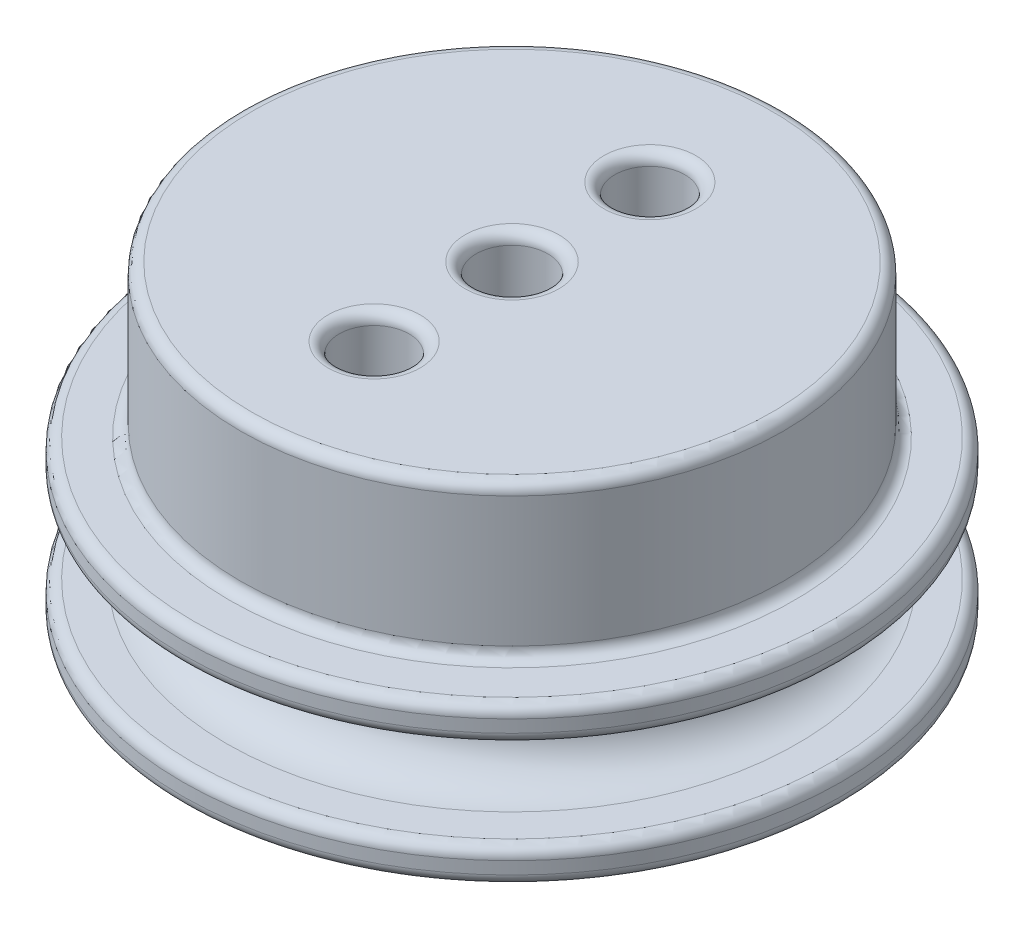
ISO-10303-21;
HEADER;
FILE_DESCRIPTION(('STEP AP214'),'2;1');
FILE_NAME('part.step','',(''),(''),'','','');
FILE_SCHEMA(('AUTOMOTIVE_DESIGN { 1 0 10303 214 1 1 1 1 }'));
ENDSEC;
DATA;
#1=APPLICATION_CONTEXT('core data for automotive mechanical design processes');
#2=APPLICATION_PROTOCOL_DEFINITION('international standard','automotive_design',2000,#1);
#3=PRODUCT_CONTEXT('',#1,'mechanical');
#4=PRODUCT('Part','Part','',(#3));
#5=PRODUCT_RELATED_PRODUCT_CATEGORY('part','',(#4));
#6=PRODUCT_DEFINITION_FORMATION('','',#4);
#7=PRODUCT_DEFINITION_CONTEXT('part definition',#1,'design');
#8=PRODUCT_DEFINITION('design','',#6,#7);
#9=PRODUCT_DEFINITION_SHAPE('','',#8);
#10=(LENGTH_UNIT() NAMED_UNIT(*) SI_UNIT(.MILLI.,.METRE.));
#11=(NAMED_UNIT(*) PLANE_ANGLE_UNIT() SI_UNIT($,.RADIAN.));
#12=(NAMED_UNIT(*) SI_UNIT($,.STERADIAN.) SOLID_ANGLE_UNIT());
#13=UNCERTAINTY_MEASURE_WITH_UNIT(LENGTH_MEASURE(1.E-05),#10,'distance_accuracy_value','');
#14=(GEOMETRIC_REPRESENTATION_CONTEXT(3) GLOBAL_UNCERTAINTY_ASSIGNED_CONTEXT((#13)) GLOBAL_UNIT_ASSIGNED_CONTEXT((#10,
#11,#12)) REPRESENTATION_CONTEXT('',''));
#15=CARTESIAN_POINT('',(0.,0.,0.));
#16=DIRECTION('',(0.,0.,1.));
#17=DIRECTION('',(1.,0.,0.));
#18=AXIS2_PLACEMENT_3D('',#15,#16,#17);
#19=CARTESIAN_POINT('',(0.,0.,0.));
#20=DIRECTION('',(0.,1.,0.));
#21=DIRECTION('',(0.,0.,1.));
#22=AXIS2_PLACEMENT_3D('',#19,#20,#21);
#23=TOROIDAL_SURFACE('',#22,13.1445,2.032);
#24=CARTESIAN_POINT('',(0.,-2.032,0.));
#25=DIRECTION('',(0.,1.,0.));
#26=DIRECTION('',(0.,0.,1.));
#27=AXIS2_PLACEMENT_3D('',#24,#25,#26);
#28=CIRCLE('',#27,13.1445);
#29=CARTESIAN_POINT('',(0.,-2.032,13.1445));
#30=VERTEX_POINT('',#29);
#31=EDGE_CURVE('E102',#30,#30,#28,.T.);
#32=ORIENTED_EDGE('',*,*,#31,.T.);
#33=EDGE_LOOP('',(#32));
#34=FACE_BOUND('',#33,.T.);
#35=CARTESIAN_POINT('',(0.,2.03199999999999,0.));
#36=DIRECTION('',(0.,1.,0.));
#37=DIRECTION('',(0.,0.,1.));
#38=AXIS2_PLACEMENT_3D('',#35,#36,#37);
#39=CIRCLE('',#38,13.1445);
#40=CARTESIAN_POINT('',(0.,2.03199999999999,13.1445));
#41=VERTEX_POINT('',#40);
#42=EDGE_CURVE('E99',#41,#41,#39,.T.);
#43=ORIENTED_EDGE('',*,*,#42,.F.);
#44=EDGE_LOOP('',(#43));
#45=FACE_BOUND('',#44,.T.);
#46=ADVANCED_FACE('F31',(#34,#45),#23,.F.);
#47=CARTESIAN_POINT('',(-13.1445,2.03199999999999,0.));
#48=DIRECTION('',(0.,-1.,0.));
#49=DIRECTION('',(0.,0.,-1.));
#50=AXIS2_PLACEMENT_3D('',#47,#48,#49);
#51=PLANE('',#50);
#52=CARTESIAN_POINT('',(0.,2.03199999999999,0.));
#53=DIRECTION('',(0.,-1.,0.));
#54=DIRECTION('',(0.,0.,-1.));
#55=AXIS2_PLACEMENT_3D('',#52,#53,#54);
#56=CIRCLE('',#55,14.6685);
#57=CARTESIAN_POINT('',(0.,2.03199999999999,-14.6685));
#58=VERTEX_POINT('',#57);
#59=EDGE_CURVE('E10',#58,#58,#56,.T.);
#60=ORIENTED_EDGE('',*,*,#59,.T.);
#61=EDGE_LOOP('',(#60));
#62=FACE_BOUND('',#61,.T.);
#63=ORIENTED_EDGE('',*,*,#42,.T.);
#64=EDGE_LOOP('',(#63));
#65=FACE_BOUND('',#64,.T.);
#66=ADVANCED_FACE('F136',(#62,#65),#51,.T.);
#67=CARTESIAN_POINT('',(0.,10.6195,0.));
#68=DIRECTION('',(0.,1.,0.));
#69=DIRECTION('',(0.,0.,1.));
#70=AXIS2_PLACEMENT_3D('',#67,#68,#69);
#71=CYLINDRICAL_SURFACE('',#70,15.1765);
#72=CARTESIAN_POINT('',(0.,3.1115,0.));
#73=DIRECTION('',(0.,1.,0.));
#74=DIRECTION('',(0.,0.,1.));
#75=AXIS2_PLACEMENT_3D('',#72,#73,#74);
#76=CIRCLE('',#75,15.1765);
#77=CARTESIAN_POINT('',(0.,3.1115,15.1765));
#78=VERTEX_POINT('',#77);
#79=EDGE_CURVE('E60',#78,#78,#76,.F.);
#80=ORIENTED_EDGE('',*,*,#79,.T.);
#81=EDGE_LOOP('',(#80));
#82=FACE_BOUND('',#81,.T.);
#83=CARTESIAN_POINT('',(0.,2.54,0.));
#84=DIRECTION('',(0.,-1.,0.));
#85=DIRECTION('',(0.,0.,-1.));
#86=AXIS2_PLACEMENT_3D('',#83,#84,#85);
#87=CIRCLE('',#86,15.1765);
#88=CARTESIAN_POINT('',(0.,2.54,-15.1765));
#89=VERTEX_POINT('',#88);
#90=EDGE_CURVE('E63',#89,#89,#87,.F.);
#91=ORIENTED_EDGE('',*,*,#90,.T.);
#92=EDGE_LOOP('',(#91));
#93=FACE_BOUND('',#92,.T.);
#94=ADVANCED_FACE('F142',(#82,#93),#71,.T.);
#95=CARTESIAN_POINT('',(-15.1765,3.6195,0.));
#96=DIRECTION('',(0.,1.,0.));
#97=DIRECTION('',(0.,0.,1.));
#98=AXIS2_PLACEMENT_3D('',#95,#96,#97);
#99=PLANE('',#98);
#100=CARTESIAN_POINT('',(0.,3.6195,0.));
#101=DIRECTION('',(0.,1.,0.));
#102=DIRECTION('',(0.,0.,1.));
#103=AXIS2_PLACEMENT_3D('',#100,#101,#102);
#104=CIRCLE('',#103,13.008000019);
#105=CARTESIAN_POINT('',(0.,3.6195,13.008000019));
#106=VERTEX_POINT('',#105);
#107=EDGE_CURVE('E66',#106,#106,#104,.F.);
#108=ORIENTED_EDGE('',*,*,#107,.T.);
#109=EDGE_LOOP('',(#108));
#110=FACE_BOUND('',#109,.T.);
#111=CARTESIAN_POINT('',(0.,3.6195,0.));
#112=DIRECTION('',(0.,1.,0.));
#113=DIRECTION('',(0.,0.,1.));
#114=AXIS2_PLACEMENT_3D('',#111,#112,#113);
#115=CIRCLE('',#114,14.6685);
#116=CARTESIAN_POINT('',(0.,3.6195,14.6685));
#117=VERTEX_POINT('',#116);
#118=EDGE_CURVE('E69',#117,#117,#115,.T.);
#119=ORIENTED_EDGE('',*,*,#118,.T.);
#120=EDGE_LOOP('',(#119));
#121=FACE_BOUND('',#120,.T.);
#122=ADVANCED_FACE('F206',(#110,#121),#99,.T.);
#123=CARTESIAN_POINT('',(0.,10.6195,0.));
#124=DIRECTION('',(0.,1.,0.));
#125=DIRECTION('',(0.,0.,1.));
#126=AXIS2_PLACEMENT_3D('',#123,#124,#125);
#127=CYLINDRICAL_SURFACE('',#126,12.500000019);
#128=CARTESIAN_POINT('',(0.,10.1115,0.));
#129=DIRECTION('',(0.,1.,0.));
#130=DIRECTION('',(0.,0.,1.));
#131=AXIS2_PLACEMENT_3D('',#128,#129,#130);
#132=CIRCLE('',#131,12.500000019);
#133=CARTESIAN_POINT('',(0.,10.1115,12.500000019));
#134=VERTEX_POINT('',#133);
#135=EDGE_CURVE('E81',#134,#134,#132,.F.);
#136=ORIENTED_EDGE('',*,*,#135,.T.);
#137=EDGE_LOOP('',(#136));
#138=FACE_BOUND('',#137,.T.);
#139=CARTESIAN_POINT('',(0.,4.1275,0.));
#140=DIRECTION('',(0.,1.,0.));
#141=DIRECTION('',(0.,0.,1.));
#142=AXIS2_PLACEMENT_3D('',#139,#140,#141);
#143=CIRCLE('',#142,12.500000019);
#144=CARTESIAN_POINT('',(0.,4.1275,12.500000019));
#145=VERTEX_POINT('',#144);
#146=EDGE_CURVE('E84',#145,#145,#143,.T.);
#147=ORIENTED_EDGE('',*,*,#146,.T.);
#148=EDGE_LOOP('',(#147));
#149=FACE_BOUND('',#148,.T.);
#150=ADVANCED_FACE('F202',(#138,#149),#127,.T.);
#151=CARTESIAN_POINT('',(-12.500000019,10.6195,0.));
#152=DIRECTION('',(0.,1.,0.));
#153=DIRECTION('',(0.,0.,1.));
#154=AXIS2_PLACEMENT_3D('',#151,#152,#153);
#155=PLANE('',#154);
#156=CARTESIAN_POINT('',(0.,10.6195,0.));
#157=DIRECTION('',(0.,1.,0.));
#158=DIRECTION('',(0.,0.,1.));
#159=AXIS2_PLACEMENT_3D('',#156,#157,#158);
#160=CIRCLE('',#159,11.992000019);
#161=CARTESIAN_POINT('',(0.,10.6195,11.992000019));
#162=VERTEX_POINT('',#161);
#163=EDGE_CURVE('E87',#162,#162,#160,.T.);
#164=ORIENTED_EDGE('',*,*,#163,.T.);
#165=EDGE_LOOP('',(#164));
#166=FACE_BOUND('',#165,.T.);
#167=CARTESIAN_POINT('',(0.,10.6195,6.35));
#168=DIRECTION('',(0.,1.,0.));
#169=DIRECTION('',(0.,0.,1.));
#170=AXIS2_PLACEMENT_3D('',#167,#168,#169);
#171=CIRCLE('',#170,2.1209);
#172=CARTESIAN_POINT('',(0.,10.6195,8.4709));
#173=VERTEX_POINT('',#172);
#174=EDGE_CURVE('E90',#173,#173,#171,.F.);
#175=ORIENTED_EDGE('',*,*,#174,.T.);
#176=EDGE_LOOP('',(#175));
#177=FACE_BOUND('',#176,.T.);
#178=CARTESIAN_POINT('',(0.,10.6195,0.));
#179=DIRECTION('',(0.,1.,0.));
#180=DIRECTION('',(0.,0.,1.));
#181=AXIS2_PLACEMENT_3D('',#178,#179,#180);
#182=CIRCLE('',#181,2.159);
#183=CARTESIAN_POINT('',(0.,10.6195,2.159));
#184=VERTEX_POINT('',#183);
#185=EDGE_CURVE('E93',#184,#184,#182,.F.);
#186=ORIENTED_EDGE('',*,*,#185,.T.);
#187=EDGE_LOOP('',(#186));
#188=FACE_BOUND('',#187,.T.);
#189=CARTESIAN_POINT('',(0.,10.6195,-6.35));
#190=DIRECTION('',(0.,1.,0.));
#191=DIRECTION('',(0.,0.,1.));
#192=AXIS2_PLACEMENT_3D('',#189,#190,#191);
#193=CIRCLE('',#192,2.1209);
#194=CARTESIAN_POINT('',(0.,10.6195,-4.2291));
#195=VERTEX_POINT('',#194);
#196=EDGE_CURVE('E96',#195,#195,#193,.F.);
#197=ORIENTED_EDGE('',*,*,#196,.T.);
#198=EDGE_LOOP('',(#197));
#199=FACE_BOUND('',#198,.T.);
#200=ADVANCED_FACE('F195',(#166,#177,#188,#199),#155,.T.);
#201=CARTESIAN_POINT('',(-15.1765,-3.6195,0.));
#202=DIRECTION('',(0.,-1.,0.));
#203=DIRECTION('',(0.,0.,-1.));
#204=AXIS2_PLACEMENT_3D('',#201,#202,#203);
#205=PLANE('',#204);
#206=CARTESIAN_POINT('',(0.,-3.6195,0.));
#207=DIRECTION('',(0.,-1.,0.));
#208=DIRECTION('',(0.,0.,-1.));
#209=AXIS2_PLACEMENT_3D('',#206,#207,#208);
#210=CIRCLE('',#209,14.6685);
#211=CARTESIAN_POINT('',(0.,-3.6195,-14.6685));
#212=VERTEX_POINT('',#211);
#213=EDGE_CURVE('E46',#212,#212,#210,.T.);
#214=ORIENTED_EDGE('',*,*,#213,.T.);
#215=EDGE_LOOP('',(#214));
#216=FACE_BOUND('',#215,.T.);
#217=CARTESIAN_POINT('',(0.,-3.6195,0.));
#218=DIRECTION('',(0.,-1.,0.));
#219=DIRECTION('',(0.,0.,-1.));
#220=AXIS2_PLACEMENT_3D('',#217,#218,#219);
#221=CIRCLE('',#220,3.429);
#222=CARTESIAN_POINT('',(0.,-3.6195,-3.429));
#223=VERTEX_POINT('',#222);
#224=EDGE_CURVE('E51',#223,#223,#221,.F.);
#225=ORIENTED_EDGE('',*,*,#224,.T.);
#226=EDGE_LOOP('',(#225));
#227=FACE_BOUND('',#226,.T.);
#228=ADVANCED_FACE('F186',(#216,#227),#205,.T.);
#229=CARTESIAN_POINT('',(0.,10.6195,0.));
#230=DIRECTION('',(0.,1.,0.));
#231=DIRECTION('',(0.,0.,1.));
#232=AXIS2_PLACEMENT_3D('',#229,#230,#231);
#233=CYLINDRICAL_SURFACE('',#232,15.1765);
#234=CARTESIAN_POINT('',(0.,-3.1115,0.));
#235=DIRECTION('',(0.,-1.,0.));
#236=DIRECTION('',(0.,0.,-1.));
#237=AXIS2_PLACEMENT_3D('',#234,#235,#236);
#238=CIRCLE('',#237,15.1765);
#239=CARTESIAN_POINT('',(0.,-3.1115,-15.1765));
#240=VERTEX_POINT('',#239);
#241=EDGE_CURVE('E54',#240,#240,#238,.F.);
#242=ORIENTED_EDGE('',*,*,#241,.T.);
#243=EDGE_LOOP('',(#242));
#244=FACE_BOUND('',#243,.T.);
#245=CARTESIAN_POINT('',(0.,-2.54,0.));
#246=DIRECTION('',(0.,1.,0.));
#247=DIRECTION('',(0.,0.,1.));
#248=AXIS2_PLACEMENT_3D('',#245,#246,#247);
#249=CIRCLE('',#248,15.1765);
#250=CARTESIAN_POINT('',(0.,-2.54,15.1765));
#251=VERTEX_POINT('',#250);
#252=EDGE_CURVE('E57',#251,#251,#249,.F.);
#253=ORIENTED_EDGE('',*,*,#252,.T.);
#254=EDGE_LOOP('',(#253));
#255=FACE_BOUND('',#254,.T.);
#256=ADVANCED_FACE('F183',(#244,#255),#233,.T.);
#257=CARTESIAN_POINT('',(-13.1445,-2.032,0.));
#258=DIRECTION('',(0.,1.,0.));
#259=DIRECTION('',(0.,0.,1.));
#260=AXIS2_PLACEMENT_3D('',#257,#258,#259);
#261=PLANE('',#260);
#262=CARTESIAN_POINT('',(0.,-2.032,0.));
#263=DIRECTION('',(0.,1.,0.));
#264=DIRECTION('',(0.,0.,1.));
#265=AXIS2_PLACEMENT_3D('',#262,#263,#264);
#266=CIRCLE('',#265,14.6685);
#267=CARTESIAN_POINT('',(0.,-2.032,14.6685));
#268=VERTEX_POINT('',#267);
#269=EDGE_CURVE('E38',#268,#268,#266,.T.);
#270=ORIENTED_EDGE('',*,*,#269,.T.);
#271=EDGE_LOOP('',(#270));
#272=FACE_BOUND('',#271,.T.);
#273=ORIENTED_EDGE('',*,*,#31,.F.);
#274=EDGE_LOOP('',(#273));
#275=FACE_BOUND('',#274,.T.);
#276=ADVANCED_FACE('F185',(#272,#275),#261,.T.);
#277=CARTESIAN_POINT('',(0.,2.9995,6.35));
#278=DIRECTION('',(0.,1.,0.));
#279=DIRECTION('',(0.,0.,1.));
#280=AXIS2_PLACEMENT_3D('',#277,#278,#279);
#281=CYLINDRICAL_SURFACE('',#280,1.6129);
#282=CARTESIAN_POINT('',(0.,10.1115,6.35));
#283=DIRECTION('',(0.,1.,0.));
#284=DIRECTION('',(0.,0.,1.));
#285=AXIS2_PLACEMENT_3D('',#282,#283,#284);
#286=CIRCLE('',#285,1.6129);
#287=CARTESIAN_POINT('',(0.,10.1115,7.9629));
#288=VERTEX_POINT('',#287);
#289=EDGE_CURVE('E78',#288,#288,#286,.T.);
#290=CARTESIAN_POINT('',(0.,2.9995,6.35));
#291=DIRECTION('',(0.,1.,0.));
#292=DIRECTION('',(0.,0.,1.));
#293=AXIS2_PLACEMENT_3D('',#290,#291,#292);
#294=CIRCLE('',#293,1.6129);
#295=CARTESIAN_POINT('',(0.,2.9995,7.9629));
#296=VERTEX_POINT('',#295);
#297=EDGE_CURVE('E106',#296,#296,#294,.T.);
#298=CARTESIAN_POINT('',(0.,10.1115,7.9629));
#299=CARTESIAN_POINT('',(0.,10.0374166666667,7.9629));
#300=CARTESIAN_POINT('',(0.,9.96333333333333,7.9629));
#301=CARTESIAN_POINT('',(0.,9.81516666666666,7.9629));
#302=CARTESIAN_POINT('',(0.,9.74108333333333,7.9629));
#303=CARTESIAN_POINT('',(0.,9.59291666666666,7.9629));
#304=CARTESIAN_POINT('',(0.,9.51883333333333,7.9629));
#305=CARTESIAN_POINT('',(0.,9.37066666666666,7.9629));
#306=CARTESIAN_POINT('',(0.,9.29658333333333,7.9629));
#307=CARTESIAN_POINT('',(0.,9.14841666666666,7.9629));
#308=CARTESIAN_POINT('',(0.,9.07433333333333,7.9629));
#309=CARTESIAN_POINT('',(0.,8.92616666666666,7.9629));
#310=CARTESIAN_POINT('',(0.,8.85208333333333,7.9629));
#311=CARTESIAN_POINT('',(0.,8.70391666666666,7.9629));
#312=CARTESIAN_POINT('',(0.,8.62983333333333,7.9629));
#313=CARTESIAN_POINT('',(0.,8.48166666666666,7.9629));
#314=CARTESIAN_POINT('',(0.,8.40758333333333,7.9629));
#315=CARTESIAN_POINT('',(0.,8.25941666666666,7.9629));
#316=CARTESIAN_POINT('',(0.,8.18533333333333,7.9629));
#317=CARTESIAN_POINT('',(0.,8.03716666666666,7.9629));
#318=CARTESIAN_POINT('',(0.,7.96308333333333,7.9629));
#319=CARTESIAN_POINT('',(0.,7.81491666666666,7.9629));
#320=CARTESIAN_POINT('',(0.,7.74083333333333,7.9629));
#321=CARTESIAN_POINT('',(0.,7.59266666666666,7.9629));
#322=CARTESIAN_POINT('',(0.,7.51858333333333,7.9629));
#323=CARTESIAN_POINT('',(0.,7.37041666666666,7.9629));
#324=CARTESIAN_POINT('',(0.,7.29633333333333,7.9629));
#325=CARTESIAN_POINT('',(0.,7.14816666666666,7.9629));
#326=CARTESIAN_POINT('',(0.,7.07408333333333,7.9629));
#327=CARTESIAN_POINT('',(0.,6.92591666666666,7.9629));
#328=CARTESIAN_POINT('',(0.,6.85183333333333,7.9629));
#329=CARTESIAN_POINT('',(0.,6.70366666666666,7.9629));
#330=CARTESIAN_POINT('',(0.,6.62958333333333,7.9629));
#331=CARTESIAN_POINT('',(0.,6.48141666666666,7.9629));
#332=CARTESIAN_POINT('',(0.,6.40733333333333,7.9629));
#333=CARTESIAN_POINT('',(0.,6.25916666666666,7.9629));
#334=CARTESIAN_POINT('',(0.,6.18508333333333,7.9629));
#335=CARTESIAN_POINT('',(0.,6.03691666666666,7.9629));
#336=CARTESIAN_POINT('',(0.,5.96283333333333,7.9629));
#337=CARTESIAN_POINT('',(0.,5.81466666666666,7.9629));
#338=CARTESIAN_POINT('',(0.,5.74058333333333,7.9629));
#339=CARTESIAN_POINT('',(0.,5.59241666666666,7.9629));
#340=CARTESIAN_POINT('',(0.,5.51833333333333,7.9629));
#341=CARTESIAN_POINT('',(0.,5.37016666666666,7.9629));
#342=CARTESIAN_POINT('',(0.,5.29608333333333,7.9629));
#343=CARTESIAN_POINT('',(0.,5.14791666666666,7.9629));
#344=CARTESIAN_POINT('',(0.,5.07383333333333,7.9629));
#345=CARTESIAN_POINT('',(0.,4.92566666666666,7.9629));
#346=CARTESIAN_POINT('',(0.,4.85158333333333,7.9629));
#347=CARTESIAN_POINT('',(0.,4.70341666666666,7.9629));
#348=CARTESIAN_POINT('',(0.,4.62933333333333,7.9629));
#349=CARTESIAN_POINT('',(0.,4.48116666666666,7.9629));
#350=CARTESIAN_POINT('',(0.,4.40708333333333,7.9629));
#351=CARTESIAN_POINT('',(0.,4.25891666666666,7.9629));
#352=CARTESIAN_POINT('',(0.,4.18483333333333,7.9629));
#353=CARTESIAN_POINT('',(0.,4.03666666666666,7.9629));
#354=CARTESIAN_POINT('',(0.,3.96258333333333,7.9629));
#355=CARTESIAN_POINT('',(0.,3.81441666666666,7.9629));
#356=CARTESIAN_POINT('',(0.,3.74033333333333,7.9629));
#357=CARTESIAN_POINT('',(0.,3.59216666666666,7.9629));
#358=CARTESIAN_POINT('',(0.,3.51808333333333,7.9629));
#359=CARTESIAN_POINT('',(0.,3.36991666666666,7.9629));
#360=CARTESIAN_POINT('',(0.,3.29583333333333,7.9629));
#361=CARTESIAN_POINT('',(0.,3.14766666666666,7.9629));
#362=CARTESIAN_POINT('',(0.,3.07358333333333,7.9629));
#363=CARTESIAN_POINT('',(0.,2.9995,7.9629));
#364=B_SPLINE_CURVE_WITH_KNOTS('',3,(#298,#299,#300,#301,#302,#303,#304,#305,#306,#307,#308,
#309,#310,#311,#312,#313,#314,#315,#316,#317,#318,#319,#320,#321,#322,#323,#324,#325,#326,#327,
#328,#329,#330,#331,#332,#333,#334,#335,#336,#337,#338,#339,#340,#341,#342,#343,#344,#345,#346,
#347,#348,#349,#350,#351,#352,#353,#354,#355,#356,#357,#358,#359,#360,#361,#362,#363),
.UNSPECIFIED.,.F.,.F.,(4,2,2,2,2,2,2,2,2,2,2,2,2,2,2,2,2,2,2,2,2,2,2,2,2,2,2,2,2,2,2,2,4),(0.,
0.22225,0.444499999999999,0.666749999999999,0.888999999999999,1.11125,1.3335,1.55575,1.778,
2.00025,2.2225,2.44475,2.667,2.88925,3.1115,3.33375,3.556,3.77825,4.0005,4.22275,4.445,4.66725,
4.8895,5.11175,5.334,5.55625,5.7785,6.00075,6.223,6.44525,6.6675,6.88975,7.112),.UNSPECIFIED.);
#365=EDGE_CURVE('BSEAM193',#288,#296,#364,.T.);
#366=ORIENTED_EDGE('',*,*,#289,.T.);
#367=ORIENTED_EDGE('',*,*,#297,.F.);
#368=ORIENTED_EDGE('',*,*,#365,.T.);
#369=ORIENTED_EDGE('',*,*,#365,.F.);
#370=EDGE_LOOP('',(#366,#368,#367,#369));
#371=FACE_BOUND('',#370,.T.);
#372=ADVANCED_FACE('F193',(#371),#281,.F.);
#373=CARTESIAN_POINT('',(0.,2.9995,6.35));
#374=DIRECTION('',(0.,1.,0.));
#375=DIRECTION('',(0.,0.,1.));
#376=AXIS2_PLACEMENT_3D('',#373,#374,#375);
#377=PLANE('',#376);
#378=ORIENTED_EDGE('',*,*,#297,.T.);
#379=EDGE_LOOP('',(#378));
#380=FACE_BOUND('',#379,.T.);
#381=ADVANCED_FACE('F258',(#380),#377,.T.);
#382=CARTESIAN_POINT('',(0.,2.9995,0.));
#383=DIRECTION('',(0.,1.,0.));
#384=DIRECTION('',(0.,0.,1.));
#385=AXIS2_PLACEMENT_3D('',#382,#383,#384);
#386=CYLINDRICAL_SURFACE('',#385,1.651);
#387=CARTESIAN_POINT('',(0.,10.1115,0.));
#388=DIRECTION('',(0.,1.,0.));
#389=DIRECTION('',(0.,0.,1.));
#390=AXIS2_PLACEMENT_3D('',#387,#388,#389);
#391=CIRCLE('',#390,1.651);
#392=CARTESIAN_POINT('',(0.,10.1115,1.651));
#393=VERTEX_POINT('',#392);
#394=EDGE_CURVE('E75',#393,#393,#391,.T.);
#395=CARTESIAN_POINT('',(0.,2.9995,0.));
#396=DIRECTION('',(0.,1.,0.));
#397=DIRECTION('',(0.,0.,1.));
#398=AXIS2_PLACEMENT_3D('',#395,#396,#397);
#399=CIRCLE('',#398,1.651);
#400=CARTESIAN_POINT('',(0.,2.9995,1.651));
#401=VERTEX_POINT('',#400);
#402=EDGE_CURVE('E109',#401,#401,#399,.T.);
#403=CARTESIAN_POINT('',(0.,10.1115,1.651));
#404=CARTESIAN_POINT('',(0.,10.0374166666667,1.651));
#405=CARTESIAN_POINT('',(0.,9.96333333333333,1.651));
#406=CARTESIAN_POINT('',(0.,9.81516666666666,1.651));
#407=CARTESIAN_POINT('',(0.,9.74108333333333,1.651));
#408=CARTESIAN_POINT('',(0.,9.59291666666666,1.651));
#409=CARTESIAN_POINT('',(0.,9.51883333333333,1.651));
#410=CARTESIAN_POINT('',(0.,9.37066666666666,1.651));
#411=CARTESIAN_POINT('',(0.,9.29658333333333,1.651));
#412=CARTESIAN_POINT('',(0.,9.14841666666666,1.651));
#413=CARTESIAN_POINT('',(0.,9.07433333333333,1.651));
#414=CARTESIAN_POINT('',(0.,8.92616666666666,1.651));
#415=CARTESIAN_POINT('',(0.,8.85208333333333,1.651));
#416=CARTESIAN_POINT('',(0.,8.70391666666666,1.651));
#417=CARTESIAN_POINT('',(0.,8.62983333333333,1.651));
#418=CARTESIAN_POINT('',(0.,8.48166666666666,1.651));
#419=CARTESIAN_POINT('',(0.,8.40758333333333,1.651));
#420=CARTESIAN_POINT('',(0.,8.25941666666666,1.651));
#421=CARTESIAN_POINT('',(0.,8.18533333333333,1.651));
#422=CARTESIAN_POINT('',(0.,8.03716666666666,1.651));
#423=CARTESIAN_POINT('',(0.,7.96308333333333,1.651));
#424=CARTESIAN_POINT('',(0.,7.81491666666666,1.651));
#425=CARTESIAN_POINT('',(0.,7.74083333333333,1.651));
#426=CARTESIAN_POINT('',(0.,7.59266666666666,1.651));
#427=CARTESIAN_POINT('',(0.,7.51858333333333,1.651));
#428=CARTESIAN_POINT('',(0.,7.37041666666666,1.651));
#429=CARTESIAN_POINT('',(0.,7.29633333333333,1.651));
#430=CARTESIAN_POINT('',(0.,7.14816666666666,1.651));
#431=CARTESIAN_POINT('',(0.,7.07408333333333,1.651));
#432=CARTESIAN_POINT('',(0.,6.92591666666666,1.651));
#433=CARTESIAN_POINT('',(0.,6.85183333333333,1.651));
#434=CARTESIAN_POINT('',(0.,6.70366666666666,1.651));
#435=CARTESIAN_POINT('',(0.,6.62958333333333,1.651));
#436=CARTESIAN_POINT('',(0.,6.48141666666666,1.651));
#437=CARTESIAN_POINT('',(0.,6.40733333333333,1.651));
#438=CARTESIAN_POINT('',(0.,6.25916666666666,1.651));
#439=CARTESIAN_POINT('',(0.,6.18508333333333,1.651));
#440=CARTESIAN_POINT('',(0.,6.03691666666666,1.651));
#441=CARTESIAN_POINT('',(0.,5.96283333333333,1.651));
#442=CARTESIAN_POINT('',(0.,5.81466666666666,1.651));
#443=CARTESIAN_POINT('',(0.,5.74058333333333,1.651));
#444=CARTESIAN_POINT('',(0.,5.59241666666666,1.651));
#445=CARTESIAN_POINT('',(0.,5.51833333333333,1.651));
#446=CARTESIAN_POINT('',(0.,5.37016666666666,1.651));
#447=CARTESIAN_POINT('',(0.,5.29608333333333,1.651));
#448=CARTESIAN_POINT('',(0.,5.14791666666666,1.651));
#449=CARTESIAN_POINT('',(0.,5.07383333333333,1.651));
#450=CARTESIAN_POINT('',(0.,4.92566666666666,1.651));
#451=CARTESIAN_POINT('',(0.,4.85158333333333,1.651));
#452=CARTESIAN_POINT('',(0.,4.70341666666666,1.651));
#453=CARTESIAN_POINT('',(0.,4.62933333333333,1.651));
#454=CARTESIAN_POINT('',(0.,4.48116666666666,1.651));
#455=CARTESIAN_POINT('',(0.,4.40708333333333,1.651));
#456=CARTESIAN_POINT('',(0.,4.25891666666666,1.651));
#457=CARTESIAN_POINT('',(0.,4.18483333333333,1.651));
#458=CARTESIAN_POINT('',(0.,4.03666666666666,1.651));
#459=CARTESIAN_POINT('',(0.,3.96258333333333,1.651));
#460=CARTESIAN_POINT('',(0.,3.81441666666666,1.651));
#461=CARTESIAN_POINT('',(0.,3.74033333333333,1.651));
#462=CARTESIAN_POINT('',(0.,3.59216666666666,1.651));
#463=CARTESIAN_POINT('',(0.,3.51808333333333,1.651));
#464=CARTESIAN_POINT('',(0.,3.36991666666666,1.651));
#465=CARTESIAN_POINT('',(0.,3.29583333333333,1.651));
#466=CARTESIAN_POINT('',(0.,3.14766666666666,1.651));
#467=CARTESIAN_POINT('',(0.,3.07358333333333,1.651));
#468=CARTESIAN_POINT('',(0.,2.9995,1.651));
#469=B_SPLINE_CURVE_WITH_KNOTS('',3,(#403,#404,#405,#406,#407,#408,#409,#410,#411,#412,#413,
#414,#415,#416,#417,#418,#419,#420,#421,#422,#423,#424,#425,#426,#427,#428,#429,#430,#431,#432,
#433,#434,#435,#436,#437,#438,#439,#440,#441,#442,#443,#444,#445,#446,#447,#448,#449,#450,#451,
#452,#453,#454,#455,#456,#457,#458,#459,#460,#461,#462,#463,#464,#465,#466,#467,#468),
.UNSPECIFIED.,.F.,.F.,(4,2,2,2,2,2,2,2,2,2,2,2,2,2,2,2,2,2,2,2,2,2,2,2,2,2,2,2,2,2,2,2,4),(0.,
0.22225,0.444499999999999,0.666749999999999,0.888999999999999,1.11125,1.3335,1.55575,1.778,
2.00025,2.2225,2.44475,2.667,2.88925,3.1115,3.33375,3.556,3.77825,4.0005,4.22275,4.445,4.66725,
4.8895,5.11175,5.334,5.55625,5.7785,6.00075,6.223,6.44525,6.6675,6.88975,7.112),.UNSPECIFIED.);
#470=EDGE_CURVE('BSEAM265',#393,#401,#469,.T.);
#471=ORIENTED_EDGE('',*,*,#394,.T.);
#472=ORIENTED_EDGE('',*,*,#402,.F.);
#473=ORIENTED_EDGE('',*,*,#470,.T.);
#474=ORIENTED_EDGE('',*,*,#470,.F.);
#475=EDGE_LOOP('',(#471,#473,#472,#474));
#476=FACE_BOUND('',#475,.T.);
#477=ADVANCED_FACE('F265',(#476),#386,.F.);
#478=CARTESIAN_POINT('',(0.,2.9995,-6.35));
#479=DIRECTION('',(0.,1.,0.));
#480=DIRECTION('',(0.,0.,1.));
#481=AXIS2_PLACEMENT_3D('',#478,#479,#480);
#482=CYLINDRICAL_SURFACE('',#481,1.6129);
#483=CARTESIAN_POINT('',(0.,10.1115,-6.35));
#484=DIRECTION('',(0.,1.,0.));
#485=DIRECTION('',(0.,0.,1.));
#486=AXIS2_PLACEMENT_3D('',#483,#484,#485);
#487=CIRCLE('',#486,1.6129);
#488=CARTESIAN_POINT('',(0.,10.1115,-4.7371));
#489=VERTEX_POINT('',#488);
#490=EDGE_CURVE('E72',#489,#489,#487,.T.);
#491=CARTESIAN_POINT('',(0.,2.9995,-6.35));
#492=DIRECTION('',(0.,1.,0.));
#493=DIRECTION('',(0.,0.,1.));
#494=AXIS2_PLACEMENT_3D('',#491,#492,#493);
#495=CIRCLE('',#494,1.6129);
#496=CARTESIAN_POINT('',(0.,2.9995,-4.7371));
#497=VERTEX_POINT('',#496);
#498=EDGE_CURVE('E105',#497,#497,#495,.T.);
#499=CARTESIAN_POINT('',(0.,10.1115,-4.7371));
#500=CARTESIAN_POINT('',(0.,10.0374166666667,-4.7371));
#501=CARTESIAN_POINT('',(0.,9.96333333333333,-4.7371));
#502=CARTESIAN_POINT('',(0.,9.81516666666666,-4.7371));
#503=CARTESIAN_POINT('',(0.,9.74108333333333,-4.7371));
#504=CARTESIAN_POINT('',(0.,9.59291666666666,-4.7371));
#505=CARTESIAN_POINT('',(0.,9.51883333333333,-4.7371));
#506=CARTESIAN_POINT('',(0.,9.37066666666666,-4.7371));
#507=CARTESIAN_POINT('',(0.,9.29658333333333,-4.7371));
#508=CARTESIAN_POINT('',(0.,9.14841666666666,-4.7371));
#509=CARTESIAN_POINT('',(0.,9.07433333333333,-4.7371));
#510=CARTESIAN_POINT('',(0.,8.92616666666666,-4.7371));
#511=CARTESIAN_POINT('',(0.,8.85208333333333,-4.7371));
#512=CARTESIAN_POINT('',(0.,8.70391666666666,-4.7371));
#513=CARTESIAN_POINT('',(0.,8.62983333333333,-4.7371));
#514=CARTESIAN_POINT('',(0.,8.48166666666666,-4.7371));
#515=CARTESIAN_POINT('',(0.,8.40758333333333,-4.7371));
#516=CARTESIAN_POINT('',(0.,8.25941666666666,-4.7371));
#517=CARTESIAN_POINT('',(0.,8.18533333333333,-4.7371));
#518=CARTESIAN_POINT('',(0.,8.03716666666666,-4.7371));
#519=CARTESIAN_POINT('',(0.,7.96308333333333,-4.7371));
#520=CARTESIAN_POINT('',(0.,7.81491666666666,-4.7371));
#521=CARTESIAN_POINT('',(0.,7.74083333333333,-4.7371));
#522=CARTESIAN_POINT('',(0.,7.59266666666666,-4.7371));
#523=CARTESIAN_POINT('',(0.,7.51858333333333,-4.7371));
#524=CARTESIAN_POINT('',(0.,7.37041666666666,-4.7371));
#525=CARTESIAN_POINT('',(0.,7.29633333333333,-4.7371));
#526=CARTESIAN_POINT('',(0.,7.14816666666666,-4.7371));
#527=CARTESIAN_POINT('',(0.,7.07408333333333,-4.7371));
#528=CARTESIAN_POINT('',(0.,6.92591666666666,-4.7371));
#529=CARTESIAN_POINT('',(0.,6.85183333333333,-4.7371));
#530=CARTESIAN_POINT('',(0.,6.70366666666666,-4.7371));
#531=CARTESIAN_POINT('',(0.,6.62958333333333,-4.7371));
#532=CARTESIAN_POINT('',(0.,6.48141666666666,-4.7371));
#533=CARTESIAN_POINT('',(0.,6.40733333333333,-4.7371));
#534=CARTESIAN_POINT('',(0.,6.25916666666666,-4.7371));
#535=CARTESIAN_POINT('',(0.,6.18508333333333,-4.7371));
#536=CARTESIAN_POINT('',(0.,6.03691666666666,-4.7371));
#537=CARTESIAN_POINT('',(0.,5.96283333333333,-4.7371));
#538=CARTESIAN_POINT('',(0.,5.81466666666666,-4.7371));
#539=CARTESIAN_POINT('',(0.,5.74058333333333,-4.7371));
#540=CARTESIAN_POINT('',(0.,5.59241666666666,-4.7371));
#541=CARTESIAN_POINT('',(0.,5.51833333333333,-4.7371));
#542=CARTESIAN_POINT('',(0.,5.37016666666666,-4.7371));
#543=CARTESIAN_POINT('',(0.,5.29608333333333,-4.7371));
#544=CARTESIAN_POINT('',(0.,5.14791666666666,-4.7371));
#545=CARTESIAN_POINT('',(0.,5.07383333333333,-4.7371));
#546=CARTESIAN_POINT('',(0.,4.92566666666666,-4.7371));
#547=CARTESIAN_POINT('',(0.,4.85158333333333,-4.7371));
#548=CARTESIAN_POINT('',(0.,4.70341666666666,-4.7371));
#549=CARTESIAN_POINT('',(0.,4.62933333333333,-4.7371));
#550=CARTESIAN_POINT('',(0.,4.48116666666666,-4.7371));
#551=CARTESIAN_POINT('',(0.,4.40708333333333,-4.7371));
#552=CARTESIAN_POINT('',(0.,4.25891666666666,-4.7371));
#553=CARTESIAN_POINT('',(0.,4.18483333333333,-4.7371));
#554=CARTESIAN_POINT('',(0.,4.03666666666666,-4.7371));
#555=CARTESIAN_POINT('',(0.,3.96258333333333,-4.7371));
#556=CARTESIAN_POINT('',(0.,3.81441666666666,-4.7371));
#557=CARTESIAN_POINT('',(0.,3.74033333333333,-4.7371));
#558=CARTESIAN_POINT('',(0.,3.59216666666666,-4.7371));
#559=CARTESIAN_POINT('',(0.,3.51808333333333,-4.7371));
#560=CARTESIAN_POINT('',(0.,3.36991666666666,-4.7371));
#561=CARTESIAN_POINT('',(0.,3.29583333333333,-4.7371));
#562=CARTESIAN_POINT('',(0.,3.14766666666666,-4.7371));
#563=CARTESIAN_POINT('',(0.,3.07358333333333,-4.7371));
#564=CARTESIAN_POINT('',(0.,2.9995,-4.7371));
#565=B_SPLINE_CURVE_WITH_KNOTS('',3,(#499,#500,#501,#502,#503,#504,#505,#506,#507,#508,#509,
#510,#511,#512,#513,#514,#515,#516,#517,#518,#519,#520,#521,#522,#523,#524,#525,#526,#527,#528,
#529,#530,#531,#532,#533,#534,#535,#536,#537,#538,#539,#540,#541,#542,#543,#544,#545,#546,#547,
#548,#549,#550,#551,#552,#553,#554,#555,#556,#557,#558,#559,#560,#561,#562,#563,#564),
.UNSPECIFIED.,.F.,.F.,(4,2,2,2,2,2,2,2,2,2,2,2,2,2,2,2,2,2,2,2,2,2,2,2,2,2,2,2,2,2,2,2,4),(0.,
0.22225,0.444499999999999,0.666749999999999,0.888999999999999,1.11125,1.3335,1.55575,1.778,
2.00025,2.2225,2.44475,2.667,2.88925,3.1115,3.33375,3.556,3.77825,4.0005,4.22275,4.445,4.66725,
4.8895,5.11175,5.334,5.55625,5.7785,6.00075,6.223,6.44525,6.6675,6.88975,7.112),.UNSPECIFIED.);
#566=EDGE_CURVE('BSEAM270',#489,#497,#565,.T.);
#567=ORIENTED_EDGE('',*,*,#490,.T.);
#568=ORIENTED_EDGE('',*,*,#498,.F.);
#569=ORIENTED_EDGE('',*,*,#566,.T.);
#570=ORIENTED_EDGE('',*,*,#566,.F.);
#571=EDGE_LOOP('',(#567,#569,#568,#570));
#572=FACE_BOUND('',#571,.T.);
#573=ADVANCED_FACE('F270',(#572),#482,.F.);
#574=CARTESIAN_POINT('',(0.,2.9995,-6.35));
#575=DIRECTION('',(0.,1.,0.));
#576=DIRECTION('',(0.,0.,1.));
#577=AXIS2_PLACEMENT_3D('',#574,#575,#576);
#578=PLANE('',#577);
#579=ORIENTED_EDGE('',*,*,#498,.T.);
#580=EDGE_LOOP('',(#579));
#581=FACE_BOUND('',#580,.T.);
#582=ADVANCED_FACE('F132',(#581),#578,.T.);
#583=CARTESIAN_POINT('',(0.,-3.6195,0.));
#584=DIRECTION('',(0.,1.,0.));
#585=DIRECTION('',(0.,0.,1.));
#586=AXIS2_PLACEMENT_3D('',#583,#584,#585);
#587=CYLINDRICAL_SURFACE('',#586,2.921);
#588=CARTESIAN_POINT('',(0.,-3.1115,0.));
#589=DIRECTION('',(0.,-1.,0.));
#590=DIRECTION('',(0.,0.,-1.));
#591=AXIS2_PLACEMENT_3D('',#588,#589,#590);
#592=CIRCLE('',#591,2.921);
#593=CARTESIAN_POINT('',(0.,-3.1115,-2.921));
#594=VERTEX_POINT('',#593);
#595=EDGE_CURVE('E42',#594,#594,#592,.T.);
#596=ORIENTED_EDGE('',*,*,#595,.T.);
#597=EDGE_LOOP('',(#596));
#598=FACE_BOUND('',#597,.T.);
#599=CARTESIAN_POINT('',(0.,2.9995,0.));
#600=DIRECTION('',(0.,1.,0.));
#601=DIRECTION('',(0.,0.,1.));
#602=AXIS2_PLACEMENT_3D('',#599,#600,#601);
#603=CIRCLE('',#602,2.921);
#604=CARTESIAN_POINT('',(0.,2.9995,2.921));
#605=VERTEX_POINT('',#604);
#606=EDGE_CURVE('E112',#605,#605,#603,.T.);
#607=ORIENTED_EDGE('',*,*,#606,.T.);
#608=EDGE_LOOP('',(#607));
#609=FACE_BOUND('',#608,.T.);
#610=ADVANCED_FACE('F118',(#598,#609),#587,.F.);
#611=CARTESIAN_POINT('',(0.,2.9995,0.));
#612=DIRECTION('',(0.,1.,0.));
#613=DIRECTION('',(0.,0.,1.));
#614=AXIS2_PLACEMENT_3D('',#611,#612,#613);
#615=PLANE('',#614);
#616=ORIENTED_EDGE('',*,*,#402,.T.);
#617=EDGE_LOOP('',(#616));
#618=FACE_BOUND('',#617,.T.);
#619=ORIENTED_EDGE('',*,*,#606,.F.);
#620=EDGE_LOOP('',(#619));
#621=FACE_BOUND('',#620,.T.);
#622=ADVANCED_FACE('F120',(#618,#621),#615,.F.);
#623=CARTESIAN_POINT('',(0.,10.1115,0.));
#624=DIRECTION('',(0.,1.,0.));
#625=DIRECTION('',(0.,0.,1.));
#626=AXIS2_PLACEMENT_3D('',#623,#624,#625);
#627=TOROIDAL_SURFACE('',#626,11.992000019,0.508);
#628=ORIENTED_EDGE('',*,*,#135,.F.);
#629=EDGE_LOOP('',(#628));
#630=FACE_BOUND('',#629,.T.);
#631=ORIENTED_EDGE('',*,*,#163,.F.);
#632=EDGE_LOOP('',(#631));
#633=FACE_BOUND('',#632,.T.);
#634=ADVANCED_FACE('F122',(#630,#633),#627,.T.);
#635=CARTESIAN_POINT('',(0.,10.1115,6.35));
#636=DIRECTION('',(0.,1.,0.));
#637=DIRECTION('',(0.,0.,1.));
#638=AXIS2_PLACEMENT_3D('',#635,#636,#637);
#639=TOROIDAL_SURFACE('',#638,2.1209,0.508);
#640=ORIENTED_EDGE('',*,*,#174,.F.);
#641=EDGE_LOOP('',(#640));
#642=FACE_BOUND('',#641,.T.);
#643=ORIENTED_EDGE('',*,*,#289,.F.);
#644=EDGE_LOOP('',(#643));
#645=FACE_BOUND('',#644,.T.);
#646=ADVANCED_FACE('F129',(#642,#645),#639,.T.);
#647=CARTESIAN_POINT('',(0.,10.1115,0.));
#648=DIRECTION('',(0.,1.,0.));
#649=DIRECTION('',(0.,0.,1.));
#650=AXIS2_PLACEMENT_3D('',#647,#648,#649);
#651=TOROIDAL_SURFACE('',#650,2.159,0.508);
#652=ORIENTED_EDGE('',*,*,#185,.F.);
#653=EDGE_LOOP('',(#652));
#654=FACE_BOUND('',#653,.T.);
#655=ORIENTED_EDGE('',*,*,#394,.F.);
#656=EDGE_LOOP('',(#655));
#657=FACE_BOUND('',#656,.T.);
#658=ADVANCED_FACE('F149',(#654,#657),#651,.T.);
#659=CARTESIAN_POINT('',(0.,10.1115,-6.35));
#660=DIRECTION('',(0.,1.,0.));
#661=DIRECTION('',(0.,0.,1.));
#662=AXIS2_PLACEMENT_3D('',#659,#660,#661);
#663=TOROIDAL_SURFACE('',#662,2.1209,0.508);
#664=ORIENTED_EDGE('',*,*,#196,.F.);
#665=EDGE_LOOP('',(#664));
#666=FACE_BOUND('',#665,.T.);
#667=ORIENTED_EDGE('',*,*,#490,.F.);
#668=EDGE_LOOP('',(#667));
#669=FACE_BOUND('',#668,.T.);
#670=ADVANCED_FACE('F153',(#666,#669),#663,.T.);
#671=CARTESIAN_POINT('',(0.,4.1275,0.));
#672=DIRECTION('',(0.,1.,0.));
#673=DIRECTION('',(0.,0.,1.));
#674=AXIS2_PLACEMENT_3D('',#671,#672,#673);
#675=TOROIDAL_SURFACE('',#674,13.008000019,0.508);
#676=ORIENTED_EDGE('',*,*,#107,.F.);
#677=EDGE_LOOP('',(#676));
#678=FACE_BOUND('',#677,.T.);
#679=ORIENTED_EDGE('',*,*,#146,.F.);
#680=EDGE_LOOP('',(#679));
#681=FACE_BOUND('',#680,.T.);
#682=ADVANCED_FACE('F157',(#678,#681),#675,.F.);
#683=CARTESIAN_POINT('',(0.,3.1115,0.));
#684=DIRECTION('',(0.,1.,0.));
#685=DIRECTION('',(0.,0.,1.));
#686=AXIS2_PLACEMENT_3D('',#683,#684,#685);
#687=TOROIDAL_SURFACE('',#686,14.6685,0.508);
#688=ORIENTED_EDGE('',*,*,#79,.F.);
#689=EDGE_LOOP('',(#688));
#690=FACE_BOUND('',#689,.T.);
#691=ORIENTED_EDGE('',*,*,#118,.F.);
#692=EDGE_LOOP('',(#691));
#693=FACE_BOUND('',#692,.T.);
#694=ADVANCED_FACE('F161',(#690,#693),#687,.T.);
#695=CARTESIAN_POINT('',(0.,-3.1115,0.));
#696=DIRECTION('',(0.,-1.,0.));
#697=DIRECTION('',(0.,0.,-1.));
#698=AXIS2_PLACEMENT_3D('',#695,#696,#697);
#699=TOROIDAL_SURFACE('',#698,14.6685,0.508);
#700=ORIENTED_EDGE('',*,*,#213,.F.);
#701=EDGE_LOOP('',(#700));
#702=FACE_BOUND('',#701,.T.);
#703=ORIENTED_EDGE('',*,*,#241,.F.);
#704=EDGE_LOOP('',(#703));
#705=FACE_BOUND('',#704,.T.);
#706=ADVANCED_FACE('F165',(#702,#705),#699,.T.);
#707=CARTESIAN_POINT('',(0.,-3.1115,0.));
#708=DIRECTION('',(0.,-1.,0.));
#709=DIRECTION('',(0.,0.,-1.));
#710=AXIS2_PLACEMENT_3D('',#707,#708,#709);
#711=TOROIDAL_SURFACE('',#710,3.429,0.508);
#712=ORIENTED_EDGE('',*,*,#595,.F.);
#713=EDGE_LOOP('',(#712));
#714=FACE_BOUND('',#713,.T.);
#715=ORIENTED_EDGE('',*,*,#224,.F.);
#716=EDGE_LOOP('',(#715));
#717=FACE_BOUND('',#716,.T.);
#718=ADVANCED_FACE('F169',(#714,#717),#711,.T.);
#719=CARTESIAN_POINT('',(0.,-2.54,0.));
#720=DIRECTION('',(0.,1.,0.));
#721=DIRECTION('',(0.,0.,1.));
#722=AXIS2_PLACEMENT_3D('',#719,#720,#721);
#723=TOROIDAL_SURFACE('',#722,14.6685,0.508);
#724=ORIENTED_EDGE('',*,*,#252,.F.);
#725=EDGE_LOOP('',(#724));
#726=FACE_BOUND('',#725,.T.);
#727=ORIENTED_EDGE('',*,*,#269,.F.);
#728=EDGE_LOOP('',(#727));
#729=FACE_BOUND('',#728,.T.);
#730=ADVANCED_FACE('F172',(#726,#729),#723,.T.);
#731=CARTESIAN_POINT('',(0.,2.54,0.));
#732=DIRECTION('',(0.,-1.,0.));
#733=DIRECTION('',(0.,0.,-1.));
#734=AXIS2_PLACEMENT_3D('',#731,#732,#733);
#735=TOROIDAL_SURFACE('',#734,14.6685,0.508);
#736=ORIENTED_EDGE('',*,*,#59,.F.);
#737=EDGE_LOOP('',(#736));
#738=FACE_BOUND('',#737,.T.);
#739=ORIENTED_EDGE('',*,*,#90,.F.);
#740=EDGE_LOOP('',(#739));
#741=FACE_BOUND('',#740,.T.);
#742=ADVANCED_FACE('F33',(#738,#741),#735,.T.);
#743=CLOSED_SHELL('',(#46,#66,#94,#122,#150,#200,#228,#256,#276,#372,#381,#477,#573,#582,#610,
#622,#634,#646,#658,#670,#682,#694,#706,#718,#730,#742));
#744=MANIFOLD_SOLID_BREP('B2',#743);
#745=ADVANCED_BREP_SHAPE_REPRESENTATION('',(#18,#744),#14);
#746=SHAPE_DEFINITION_REPRESENTATION(#9,#745);
ENDSEC;
END-ISO-10303-21;
